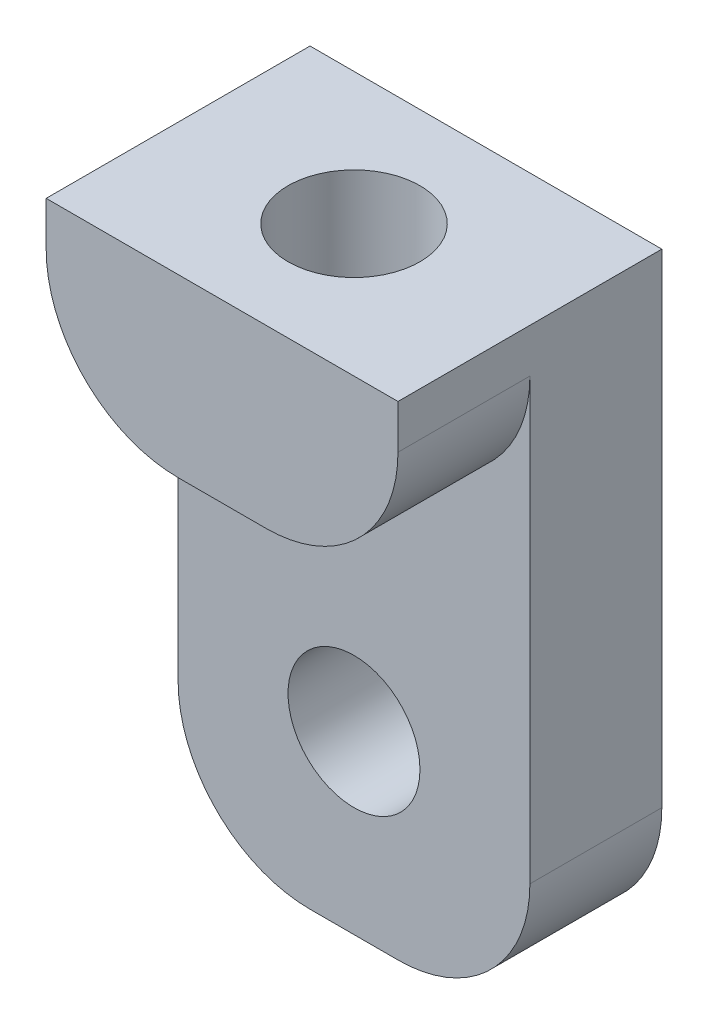
ISO-10303-21;
HEADER;
FILE_DESCRIPTION(('STEP AP214'),'2;1');
FILE_NAME('part.step','',(''),(''),'','','');
FILE_SCHEMA(('AUTOMOTIVE_DESIGN { 1 0 10303 214 1 1 1 1 }'));
ENDSEC;
DATA;
#1=APPLICATION_CONTEXT('core data for automotive mechanical design processes');
#2=APPLICATION_PROTOCOL_DEFINITION('international standard','automotive_design',2000,#1);
#3=PRODUCT_CONTEXT('',#1,'mechanical');
#4=PRODUCT('Part','Part','',(#3));
#5=PRODUCT_RELATED_PRODUCT_CATEGORY('part','',(#4));
#6=PRODUCT_DEFINITION_FORMATION('','',#4);
#7=PRODUCT_DEFINITION_CONTEXT('part definition',#1,'design');
#8=PRODUCT_DEFINITION('design','',#6,#7);
#9=PRODUCT_DEFINITION_SHAPE('','',#8);
#10=(LENGTH_UNIT() NAMED_UNIT(*) SI_UNIT(.MILLI.,.METRE.));
#11=(NAMED_UNIT(*) PLANE_ANGLE_UNIT() SI_UNIT($,.RADIAN.));
#12=(NAMED_UNIT(*) SI_UNIT($,.STERADIAN.) SOLID_ANGLE_UNIT());
#13=UNCERTAINTY_MEASURE_WITH_UNIT(LENGTH_MEASURE(1.E-05),#10,'distance_accuracy_value','');
#14=(GEOMETRIC_REPRESENTATION_CONTEXT(3) GLOBAL_UNCERTAINTY_ASSIGNED_CONTEXT((#13)) GLOBAL_UNIT_ASSIGNED_CONTEXT((#10,
#11,#12)) REPRESENTATION_CONTEXT('',''));
#15=CARTESIAN_POINT('',(0.,0.,0.));
#16=DIRECTION('',(0.,0.,1.));
#17=DIRECTION('',(1.,0.,0.));
#18=AXIS2_PLACEMENT_3D('',#15,#16,#17);
#19=CARTESIAN_POINT('',(0.,30.,0.));
#20=DIRECTION('',(0.,1.,0.));
#21=DIRECTION('',(0.,0.,1.));
#22=AXIS2_PLACEMENT_3D('',#19,#20,#21);
#23=PLANE('',#22);
#24=CARTESIAN_POINT('',(0.,30.,15.));
#25=DIRECTION('',(0.,1.,0.));
#26=DIRECTION('',(0.,0.,1.));
#27=AXIS2_PLACEMENT_3D('',#24,#25,#26);
#28=CIRCLE('',#27,7.5);
#29=CARTESIAN_POINT('',(7.5,30.,15.));
#30=VERTEX_POINT('',#29);
#31=CARTESIAN_POINT('',(-7.5,30.,15.));
#32=VERTEX_POINT('',#31);
#33=EDGE_CURVE('E54',#30,#32,#28,.T.);
#34=ORIENTED_EDGE('',*,*,#33,.T.);
#35=DIRECTION('',(1.,0.,0.));
#36=VECTOR('',#35,1.);
#37=CARTESIAN_POINT('',(-20.,30.,15.));
#38=LINE('',#37,#36);
#39=EDGE_CURVE('E57',#32,#30,#38,.T.);
#40=ORIENTED_EDGE('',*,*,#39,.T.);
#41=EDGE_LOOP('',(#34,#40));
#42=FACE_BOUND('',#41,.T.);
#43=ADVANCED_FACE('F39',(#42),#23,.T.);
#44=CARTESIAN_POINT('',(0.,0.,30.));
#45=DIRECTION('',(0.,0.,1.));
#46=DIRECTION('',(1.,0.,0.));
#47=AXIS2_PLACEMENT_3D('',#44,#45,#46);
#48=PLANE('',#47);
#49=DIRECTION('',(0.,-1.,0.));
#50=VECTOR('',#49,1.);
#51=CARTESIAN_POINT('',(-20.,50.,30.));
#52=LINE('',#51,#50);
#53=CARTESIAN_POINT('',(-20.,50.,30.));
#54=VERTEX_POINT('',#53);
#55=CARTESIAN_POINT('',(-20.,45.,30.));
#56=VERTEX_POINT('',#55);
#57=EDGE_CURVE('E138',#54,#56,#52,.T.);
#58=ORIENTED_EDGE('',*,*,#57,.T.);
#59=CARTESIAN_POINT('',(-5.00000000000001,45.,30.));
#60=DIRECTION('',(0.,0.,1.));
#61=DIRECTION('',(1.,0.,0.));
#62=AXIS2_PLACEMENT_3D('',#59,#60,#61);
#63=CIRCLE('',#62,15.);
#64=CARTESIAN_POINT('',(-5.00000000000001,30.,30.));
#65=VERTEX_POINT('',#64);
#66=EDGE_CURVE('E189',#56,#65,#63,.T.);
#67=ORIENTED_EDGE('',*,*,#66,.T.);
#68=DIRECTION('',(1.,0.,0.));
#69=VECTOR('',#68,1.);
#70=CARTESIAN_POINT('',(-20.,30.,30.));
#71=LINE('',#70,#69);
#72=CARTESIAN_POINT('',(5.00000000000001,30.,30.));
#73=VERTEX_POINT('',#72);
#74=EDGE_CURVE('E413',#65,#73,#71,.T.);
#75=ORIENTED_EDGE('',*,*,#74,.T.);
#76=CARTESIAN_POINT('',(5.00000000000001,45.,30.));
#77=DIRECTION('',(0.,0.,1.));
#78=DIRECTION('',(1.,0.,0.));
#79=AXIS2_PLACEMENT_3D('',#76,#77,#78);
#80=CIRCLE('',#79,15.);
#81=CARTESIAN_POINT('',(20.,45.,30.));
#82=VERTEX_POINT('',#81);
#83=EDGE_CURVE('E133',#73,#82,#80,.T.);
#84=ORIENTED_EDGE('',*,*,#83,.T.);
#85=DIRECTION('',(0.,1.,0.));
#86=VECTOR('',#85,1.);
#87=CARTESIAN_POINT('',(20.,50.,30.));
#88=LINE('',#87,#86);
#89=CARTESIAN_POINT('',(20.,50.,30.));
#90=VERTEX_POINT('',#89);
#91=EDGE_CURVE('E125',#82,#90,#88,.T.);
#92=ORIENTED_EDGE('',*,*,#91,.T.);
#93=DIRECTION('',(-1.,0.,0.));
#94=VECTOR('',#93,1.);
#95=CARTESIAN_POINT('',(-20.,50.,30.));
#96=LINE('',#95,#94);
#97=EDGE_CURVE('E130',#90,#54,#96,.T.);
#98=ORIENTED_EDGE('',*,*,#97,.T.);
#99=EDGE_LOOP('',(#58,#67,#75,#84,#92,#98));
#100=FACE_BOUND('',#99,.T.);
#101=ADVANCED_FACE('F128',(#100),#48,.T.);
#102=CARTESIAN_POINT('',(-20.,50.,30.));
#103=DIRECTION('',(1.,0.,0.));
#104=DIRECTION('',(0.,1.,0.));
#105=AXIS2_PLACEMENT_3D('',#102,#103,#104);
#106=PLANE('',#105);
#107=DIRECTION('',(0.,1.,0.));
#108=VECTOR('',#107,1.);
#109=CARTESIAN_POINT('',(-20.,-20.,15.));
#110=LINE('',#109,#108);
#111=CARTESIAN_POINT('',(-20.,-5.,15.));
#112=VERTEX_POINT('',#111);
#113=CARTESIAN_POINT('',(-20.,45.,15.));
#114=VERTEX_POINT('',#113);
#115=EDGE_CURVE('E180',#112,#114,#110,.T.);
#116=ORIENTED_EDGE('',*,*,#115,.T.);
#117=DIRECTION('',(0.,0.,1.));
#118=VECTOR('',#117,1.);
#119=CARTESIAN_POINT('',(-20.,45.,30.));
#120=LINE('',#119,#118);
#121=EDGE_CURVE('E183',#114,#56,#120,.T.);
#122=ORIENTED_EDGE('',*,*,#121,.T.);
#123=ORIENTED_EDGE('',*,*,#57,.F.);
#124=DIRECTION('',(0.,0.,-1.));
#125=VECTOR('',#124,1.);
#126=CARTESIAN_POINT('',(-20.,50.,30.));
#127=LINE('',#126,#125);
#128=CARTESIAN_POINT('',(-20.,50.,0.));
#129=VERTEX_POINT('',#128);
#130=EDGE_CURVE('E150',#54,#129,#127,.T.);
#131=ORIENTED_EDGE('',*,*,#130,.T.);
#132=DIRECTION('',(0.,-1.,0.));
#133=VECTOR('',#132,1.);
#134=CARTESIAN_POINT('',(-20.,50.,0.));
#135=LINE('',#134,#133);
#136=CARTESIAN_POINT('',(-20.,-5.,0.));
#137=VERTEX_POINT('',#136);
#138=EDGE_CURVE('E161',#129,#137,#135,.T.);
#139=ORIENTED_EDGE('',*,*,#138,.T.);
#140=DIRECTION('',(0.,0.,-1.));
#141=VECTOR('',#140,1.);
#142=CARTESIAN_POINT('',(-20.,-5.,30.));
#143=LINE('',#142,#141);
#144=EDGE_CURVE('E149',#137,#112,#143,.F.);
#145=ORIENTED_EDGE('',*,*,#144,.T.);
#146=EDGE_LOOP('',(#116,#122,#123,#131,#139,#145));
#147=FACE_BOUND('',#146,.T.);
#148=ADVANCED_FACE('F234',(#147),#106,.F.);
#149=CARTESIAN_POINT('',(-20.,-20.,30.));
#150=DIRECTION('',(0.,1.,0.));
#151=DIRECTION('',(0.,0.,1.));
#152=AXIS2_PLACEMENT_3D('',#149,#150,#151);
#153=PLANE('',#152);
#154=DIRECTION('',(1.,0.,0.));
#155=VECTOR('',#154,1.);
#156=CARTESIAN_POINT('',(-20.,-20.,0.));
#157=LINE('',#156,#155);
#158=CARTESIAN_POINT('',(-5.,-20.,0.));
#159=VERTEX_POINT('',#158);
#160=CARTESIAN_POINT('',(5.,-20.,0.));
#161=VERTEX_POINT('',#160);
#162=EDGE_CURVE('E165',#159,#161,#157,.T.);
#163=ORIENTED_EDGE('',*,*,#162,.T.);
#164=DIRECTION('',(0.,0.,-1.));
#165=VECTOR('',#164,1.);
#166=CARTESIAN_POINT('',(5.,-20.,30.));
#167=LINE('',#166,#165);
#168=CARTESIAN_POINT('',(5.,-20.,15.));
#169=VERTEX_POINT('',#168);
#170=EDGE_CURVE('E350',#161,#169,#167,.F.);
#171=ORIENTED_EDGE('',*,*,#170,.T.);
#172=DIRECTION('',(1.,0.,0.));
#173=VECTOR('',#172,1.);
#174=CARTESIAN_POINT('',(-20.,-20.,15.));
#175=LINE('',#174,#173);
#176=CARTESIAN_POINT('',(-5.,-20.,15.));
#177=VERTEX_POINT('',#176);
#178=EDGE_CURVE('E402',#177,#169,#175,.T.);
#179=ORIENTED_EDGE('',*,*,#178,.F.);
#180=DIRECTION('',(0.,0.,-1.));
#181=VECTOR('',#180,1.);
#182=CARTESIAN_POINT('',(-5.,-20.,30.));
#183=LINE('',#182,#181);
#184=EDGE_CURVE('E343',#177,#159,#183,.T.);
#185=ORIENTED_EDGE('',*,*,#184,.T.);
#186=EDGE_LOOP('',(#163,#171,#179,#185));
#187=FACE_BOUND('',#186,.T.);
#188=ADVANCED_FACE('F243',(#187),#153,.F.);
#189=CARTESIAN_POINT('',(20.,50.,30.));
#190=DIRECTION('',(-1.,0.,0.));
#191=DIRECTION('',(0.,-1.,0.));
#192=AXIS2_PLACEMENT_3D('',#189,#190,#191);
#193=PLANE('',#192);
#194=ORIENTED_EDGE('',*,*,#91,.F.);
#195=DIRECTION('',(0.,0.,1.));
#196=VECTOR('',#195,1.);
#197=CARTESIAN_POINT('',(20.,45.,15.));
#198=LINE('',#197,#196);
#199=CARTESIAN_POINT('',(20.,45.,15.));
#200=VERTEX_POINT('',#199);
#201=EDGE_CURVE('E387',#82,#200,#198,.F.);
#202=ORIENTED_EDGE('',*,*,#201,.T.);
#203=DIRECTION('',(0.,1.,0.));
#204=VECTOR('',#203,1.);
#205=CARTESIAN_POINT('',(20.,-20.,15.));
#206=LINE('',#205,#204);
#207=CARTESIAN_POINT('',(20.,-5.00000000000001,15.));
#208=VERTEX_POINT('',#207);
#209=EDGE_CURVE('E407',#208,#200,#206,.T.);
#210=ORIENTED_EDGE('',*,*,#209,.F.);
#211=DIRECTION('',(0.,0.,-1.));
#212=VECTOR('',#211,1.);
#213=CARTESIAN_POINT('',(20.,-5.,30.));
#214=LINE('',#213,#212);
#215=CARTESIAN_POINT('',(20.,-5.,0.));
#216=VERTEX_POINT('',#215);
#217=EDGE_CURVE('E391',#208,#216,#214,.T.);
#218=ORIENTED_EDGE('',*,*,#217,.T.);
#219=DIRECTION('',(0.,1.,0.));
#220=VECTOR('',#219,1.);
#221=CARTESIAN_POINT('',(20.,50.,0.));
#222=LINE('',#221,#220);
#223=CARTESIAN_POINT('',(20.,50.,0.));
#224=VERTEX_POINT('',#223);
#225=EDGE_CURVE('E145',#216,#224,#222,.T.);
#226=ORIENTED_EDGE('',*,*,#225,.T.);
#227=DIRECTION('',(0.,0.,-1.));
#228=VECTOR('',#227,1.);
#229=CARTESIAN_POINT('',(20.,50.,30.));
#230=LINE('',#229,#228);
#231=EDGE_CURVE('E141',#90,#224,#230,.T.);
#232=ORIENTED_EDGE('',*,*,#231,.F.);
#233=EDGE_LOOP('',(#194,#202,#210,#218,#226,#232));
#234=FACE_BOUND('',#233,.T.);
#235=ADVANCED_FACE('F142',(#234),#193,.F.);
#236=CARTESIAN_POINT('',(0.,0.,30.));
#237=DIRECTION('',(0.,0.,-1.));
#238=DIRECTION('',(-1.,0.,0.));
#239=AXIS2_PLACEMENT_3D('',#236,#237,#238);
#240=CYLINDRICAL_SURFACE('',#239,7.5);
#241=CARTESIAN_POINT('',(0.,0.,0.));
#242=DIRECTION('',(0.,0.,1.));
#243=DIRECTION('',(1.,0.,0.));
#244=AXIS2_PLACEMENT_3D('',#241,#242,#243);
#245=CIRCLE('',#244,7.5);
#246=CARTESIAN_POINT('',(7.5,0.,0.));
#247=VERTEX_POINT('',#246);
#248=EDGE_CURVE('E166',#247,#247,#245,.T.);
#249=ORIENTED_EDGE('',*,*,#248,.F.);
#250=EDGE_LOOP('',(#249));
#251=FACE_BOUND('',#250,.T.);
#252=CARTESIAN_POINT('',(0.,0.,15.));
#253=DIRECTION('',(0.,0.,1.));
#254=DIRECTION('',(1.,0.,0.));
#255=AXIS2_PLACEMENT_3D('',#252,#253,#254);
#256=CIRCLE('',#255,7.5);
#257=CARTESIAN_POINT('',(7.5,0.,15.));
#258=VERTEX_POINT('',#257);
#259=EDGE_CURVE('E175',#258,#258,#256,.T.);
#260=ORIENTED_EDGE('',*,*,#259,.T.);
#261=EDGE_LOOP('',(#260));
#262=FACE_BOUND('',#261,.T.);
#263=ADVANCED_FACE('F226',(#251,#262),#240,.F.);
#264=CARTESIAN_POINT('',(0.,0.,0.));
#265=DIRECTION('',(0.,0.,1.));
#266=DIRECTION('',(1.,0.,0.));
#267=AXIS2_PLACEMENT_3D('',#264,#265,#266);
#268=PLANE('',#267);
#269=ORIENTED_EDGE('',*,*,#225,.F.);
#270=CARTESIAN_POINT('',(5.,-5.,0.));
#271=DIRECTION('',(0.,0.,1.));
#272=DIRECTION('',(1.,0.,0.));
#273=AXIS2_PLACEMENT_3D('',#270,#271,#272);
#274=CIRCLE('',#273,15.);
#275=EDGE_CURVE('E395',#216,#161,#274,.F.);
#276=ORIENTED_EDGE('',*,*,#275,.T.);
#277=ORIENTED_EDGE('',*,*,#162,.F.);
#278=CARTESIAN_POINT('',(-5.,-5.,0.));
#279=DIRECTION('',(0.,0.,1.));
#280=DIRECTION('',(1.,0.,0.));
#281=AXIS2_PLACEMENT_3D('',#278,#279,#280);
#282=CIRCLE('',#281,15.);
#283=EDGE_CURVE('E390',#159,#137,#282,.F.);
#284=ORIENTED_EDGE('',*,*,#283,.T.);
#285=ORIENTED_EDGE('',*,*,#138,.F.);
#286=DIRECTION('',(-1.,0.,0.));
#287=VECTOR('',#286,1.);
#288=CARTESIAN_POINT('',(-20.,50.,0.));
#289=LINE('',#288,#287);
#290=EDGE_CURVE('E172',#224,#129,#289,.T.);
#291=ORIENTED_EDGE('',*,*,#290,.F.);
#292=EDGE_LOOP('',(#269,#276,#277,#284,#285,#291));
#293=FACE_BOUND('',#292,.T.);
#294=ORIENTED_EDGE('',*,*,#248,.T.);
#295=EDGE_LOOP('',(#294));
#296=FACE_BOUND('',#295,.T.);
#297=ADVANCED_FACE('F230',(#293,#296),#268,.F.);
#298=CARTESIAN_POINT('',(-20.,50.,30.));
#299=DIRECTION('',(0.,-1.,0.));
#300=DIRECTION('',(0.,0.,-1.));
#301=AXIS2_PLACEMENT_3D('',#298,#299,#300);
#302=PLANE('',#301);
#303=CARTESIAN_POINT('',(0.,50.,15.));
#304=DIRECTION('',(0.,1.,0.));
#305=DIRECTION('',(0.,0.,1.));
#306=AXIS2_PLACEMENT_3D('',#303,#304,#305);
#307=CIRCLE('',#306,7.5);
#308=CARTESIAN_POINT('',(0.,50.,22.5));
#309=VERTEX_POINT('',#308);
#310=EDGE_CURVE('E374',#309,#309,#307,.T.);
#311=ORIENTED_EDGE('',*,*,#310,.F.);
#312=EDGE_LOOP('',(#311));
#313=FACE_BOUND('',#312,.T.);
#314=ORIENTED_EDGE('',*,*,#290,.T.);
#315=ORIENTED_EDGE('',*,*,#130,.F.);
#316=ORIENTED_EDGE('',*,*,#97,.F.);
#317=ORIENTED_EDGE('',*,*,#231,.T.);
#318=EDGE_LOOP('',(#314,#315,#316,#317));
#319=FACE_BOUND('',#318,.T.);
#320=ADVANCED_FACE('F152',(#313,#319),#302,.F.);
#321=CARTESIAN_POINT('',(0.,30.,15.));
#322=DIRECTION('',(0.,1.,0.));
#323=DIRECTION('',(0.,0.,1.));
#324=AXIS2_PLACEMENT_3D('',#321,#322,#323);
#325=CYLINDRICAL_SURFACE('',#324,7.5);
#326=CARTESIAN_POINT('',(-5.00000000000001,30.,20.5901699437495));
#327=VERTEX_POINT('',#326);
#328=CARTESIAN_POINT('',(5.00000000000001,30.,20.5901699437495));
#329=VERTEX_POINT('',#328);
#330=EDGE_CURVE('E179',#327,#329,#28,.T.);
#331=ORIENTED_EDGE('',*,*,#330,.F.);
#332=CARTESIAN_POINT('',(-5.00000000000001,30.,20.5901699437495));
#333=CARTESIAN_POINT('',(-5.15663344575459,29.9999978303104,20.4501051414938));
#334=CARTESIAN_POINT('',(-5.30732754314871,30.0024537237757,20.3034421050508));
#335=CARTESIAN_POINT('',(-5.59580804645587,30.0111435883526,19.9980934292791));
#336=CARTESIAN_POINT('',(-5.7335975760952,30.0173766424079,19.8394107163865));
#337=CARTESIAN_POINT('',(-5.9952148366046,30.0324779884707,19.5112555362672));
#338=CARTESIAN_POINT('',(-6.11905337737117,30.0413442205223,19.3417915844213));
#339=CARTESIAN_POINT('',(-6.35206901812086,30.0606030984697,18.9931413005001));
#340=CARTESIAN_POINT('',(-6.46124549102694,30.0709958096114,18.8139545530537));
#341=CARTESIAN_POINT('',(-6.66418146031628,30.0922532551697,18.4471174990133));
#342=CARTESIAN_POINT('',(-6.75794330805307,30.1031179172747,18.2594684888317));
#343=CARTESIAN_POINT('',(-6.92943411166736,30.1243570340514,17.8769554999541));
#344=CARTESIAN_POINT('',(-7.00716314928027,30.1347314912221,17.6820915580459));
#345=CARTESIAN_POINT('',(-7.14603413692196,30.1541434492909,17.2865105169181));
#346=CARTESIAN_POINT('',(-7.20717888242539,30.1631811753936,17.0857944104737));
#347=CARTESIAN_POINT('',(-7.31245566261449,30.1792244585586,16.6798679055726));
#348=CARTESIAN_POINT('',(-7.35658773370456,30.1862300199695,16.4746575167339));
#349=CARTESIAN_POINT('',(-7.42766500485304,30.197711400443,16.0602728203928));
#350=CARTESIAN_POINT('',(-7.45453326021265,30.2021758839963,15.8510849871964));
#351=CARTESIAN_POINT('',(-7.4905623375704,30.2081970563272,15.4311464946836));
#352=CARTESIAN_POINT('',(-7.49972308710657,30.2097537332054,15.2203958289755));
#353=CARTESIAN_POINT('',(-7.50026453144197,30.209845257095,14.7988770384197));
#354=CARTESIAN_POINT('',(-7.49164572593859,30.208380189033,14.5881089142293));
#355=CARTESIAN_POINT('',(-7.45669720722081,30.2025356376118,14.168089030511));
#356=CARTESIAN_POINT('',(-7.4303676323111,30.1981561770114,13.9588372591547));
#357=CARTESIAN_POINT('',(-7.36064799928906,30.1868785261535,13.5459946810235));
#358=CARTESIAN_POINT('',(-7.31747808101943,30.1800129151642,13.3423657457407));
#359=CARTESIAN_POINT('',(-7.21436986767921,30.1642565396045,12.9393826214284));
#360=CARTESIAN_POINT('',(-7.15442405514111,30.155364867466,12.7400303920576));
#361=CARTESIAN_POINT('',(-7.01818739304532,30.136230367199,12.3470188916852));
#362=CARTESIAN_POINT('',(-6.94189353402911,30.1259872904285,12.1533606763506));
#363=CARTESIAN_POINT('',(-6.77353044043229,30.1049746885494,11.7731604847035));
#364=CARTESIAN_POINT('',(-6.68146805943198,30.0942053936019,11.5866154596231));
#365=CARTESIAN_POINT('',(-6.47973744880902,30.0728131023185,11.2173651672977));
#366=CARTESIAN_POINT('',(-6.36969614342315,30.0622000006072,11.0348629815442));
#367=CARTESIAN_POINT('',(-6.13444857364372,30.0424950294228,10.6798268314861));
#368=CARTESIAN_POINT('',(-6.00924263972168,30.0334031268096,10.5072926500773));
#369=CARTESIAN_POINT('',(-5.74439588116252,30.0178948657955,10.1732662989898));
#370=CARTESIAN_POINT('',(-5.604740967318,30.0114811501685,10.0117851669272));
#371=CARTESIAN_POINT('',(-5.31210296626037,30.0025321683687,9.70120756269242));
#372=CARTESIAN_POINT('',(-5.15911680082516,29.9999978004693,9.55211396644327));
#373=CARTESIAN_POINT('',(-5.00000000000001,30.,9.40983005625053));
#374=B_SPLINE_CURVE_WITH_KNOTS('',3,(#332,#333,#334,#335,#336,#337,#338,#339,#340,#341,#342,
#343,#344,#345,#346,#347,#348,#349,#350,#351,#352,#353,#354,#355,#356,#357,#358,#359,#360,#361,
#362,#363,#364,#365,#366,#367,#368,#369,#370,#371,#372,#373),.UNSPECIFIED.,.F.,.F.,(4,2,2,2,2,2,
2,2,2,2,2,2,2,2,2,2,2,2,2,2,4),(0.,0.630131786436626,1.26011064450682,1.88959795754474,
2.51911218434564,3.14853029549866,3.77794519779275,4.40725393888139,5.03656133334272,
5.66865443913942,6.30075013155758,6.93282805906215,7.56490105068163,8.18897434663033,
8.81332774589868,9.43779617923999,10.0619938811669,10.7013413169057,11.3406748223252,
11.9806377250904,12.620748790577),.UNSPECIFIED.);
#375=CARTESIAN_POINT('',(-7.5,30.209800542251,15.));
#376=VERTEX_POINT('',#375);
#377=EDGE_CURVE('E209',#327,#376,#374,.T.);
#378=ORIENTED_EDGE('',*,*,#377,.T.);
#379=DIRECTION('',(0.,1.,0.));
#380=VECTOR('',#379,1.);
#381=CARTESIAN_POINT('',(-7.5,30.,15.));
#382=LINE('',#381,#380);
#383=EDGE_CURVE('E11',#376,#32,#382,.F.);
#384=ORIENTED_EDGE('',*,*,#383,.T.);
#385=ORIENTED_EDGE('',*,*,#33,.F.);
#386=DIRECTION('',(0.,1.,0.));
#387=VECTOR('',#386,1.);
#388=CARTESIAN_POINT('',(7.5,30.,15.));
#389=LINE('',#388,#387);
#390=CARTESIAN_POINT('',(7.5,30.209800542251,15.));
#391=VERTEX_POINT('',#390);
#392=EDGE_CURVE('E48',#391,#30,#389,.F.);
#393=ORIENTED_EDGE('',*,*,#392,.F.);
#394=CARTESIAN_POINT('',(5.00000000000001,30.,9.40983005625053));
#395=CARTESIAN_POINT('',(5.15663344575459,29.9999978303104,9.54989485850619));
#396=CARTESIAN_POINT('',(5.30732754314871,30.0024537237757,9.69655789494924));
#397=CARTESIAN_POINT('',(5.59580804645587,30.0111435883526,10.0019065707209));
#398=CARTESIAN_POINT('',(5.7335975760952,30.0173766424079,10.1605892836135));
#399=CARTESIAN_POINT('',(5.9952148366046,30.0324779884707,10.4887444637328));
#400=CARTESIAN_POINT('',(6.11905337737117,30.0413442205223,10.6582084155787));
#401=CARTESIAN_POINT('',(6.35206901812086,30.0606030984697,11.0068586994999));
#402=CARTESIAN_POINT('',(6.46124549102694,30.0709958096114,11.1860454469463));
#403=CARTESIAN_POINT('',(6.66418146031628,30.0922532551697,11.5528825009867));
#404=CARTESIAN_POINT('',(6.75794330805307,30.1031179172747,11.7405315111683));
#405=CARTESIAN_POINT('',(6.92943411166736,30.1243570340514,12.1230445000459));
#406=CARTESIAN_POINT('',(7.00716314928027,30.1347314912221,12.3179084419541));
#407=CARTESIAN_POINT('',(7.14603413692196,30.1541434492909,12.7134894830819));
#408=CARTESIAN_POINT('',(7.20717888242539,30.1631811753936,12.9142055895263));
#409=CARTESIAN_POINT('',(7.31245566261449,30.1792244585586,13.3201320944274));
#410=CARTESIAN_POINT('',(7.35658773370456,30.1862300199695,13.5253424832661));
#411=CARTESIAN_POINT('',(7.42766500485304,30.197711400443,13.9397271796072));
#412=CARTESIAN_POINT('',(7.45453326021265,30.2021758839963,14.1489150128036));
#413=CARTESIAN_POINT('',(7.4905623375704,30.2081970563272,14.5688535053164));
#414=CARTESIAN_POINT('',(7.49972308710657,30.2097537332054,14.7796041710245));
#415=CARTESIAN_POINT('',(7.50026453144197,30.209845257095,15.2011229615803));
#416=CARTESIAN_POINT('',(7.49164572593859,30.208380189033,15.4118910857707));
#417=CARTESIAN_POINT('',(7.45669720722081,30.2025356376118,15.831910969489));
#418=CARTESIAN_POINT('',(7.4303676323111,30.1981561770114,16.0411627408453));
#419=CARTESIAN_POINT('',(7.36064799928906,30.1868785261535,16.4540053189765));
#420=CARTESIAN_POINT('',(7.31747808101943,30.1800129151642,16.6576342542593));
#421=CARTESIAN_POINT('',(7.21436986767922,30.1642565396045,17.0606173785716));
#422=CARTESIAN_POINT('',(7.15442405514111,30.155364867466,17.2599696079424));
#423=CARTESIAN_POINT('',(7.01818739304532,30.136230367199,17.6529811083148));
#424=CARTESIAN_POINT('',(6.94189353402911,30.1259872904285,17.8466393236494));
#425=CARTESIAN_POINT('',(6.77353044043229,30.1049746885494,18.2268395152965));
#426=CARTESIAN_POINT('',(6.68146805943198,30.0942053936019,18.4133845403769));
#427=CARTESIAN_POINT('',(6.47973744880902,30.0728131023185,18.7826348327023));
#428=CARTESIAN_POINT('',(6.36969614342315,30.0622000006072,18.9651370184558));
#429=CARTESIAN_POINT('',(6.13444857364372,30.0424950294228,19.3201731685139));
#430=CARTESIAN_POINT('',(6.00924263972168,30.0334031268096,19.4927073499227));
#431=CARTESIAN_POINT('',(5.74439588116252,30.0178948657955,19.8267337010102));
#432=CARTESIAN_POINT('',(5.604740967318,30.0114811501685,19.9882148330728));
#433=CARTESIAN_POINT('',(5.31210296626037,30.0025321683687,20.2987924373076));
#434=CARTESIAN_POINT('',(5.15911680082516,29.9999978004693,20.4478860335567));
#435=CARTESIAN_POINT('',(5.00000000000001,30.,20.5901699437495));
#436=B_SPLINE_CURVE_WITH_KNOTS('',3,(#394,#395,#396,#397,#398,#399,#400,#401,#402,#403,#404,
#405,#406,#407,#408,#409,#410,#411,#412,#413,#414,#415,#416,#417,#418,#419,#420,#421,#422,#423,
#424,#425,#426,#427,#428,#429,#430,#431,#432,#433,#434,#435),.UNSPECIFIED.,.F.,.F.,(4,2,2,2,2,2,
2,2,2,2,2,2,2,2,2,2,2,2,2,2,4),(0.,0.630131786436628,1.26011064450682,1.88959795754474,
2.51911218434564,3.14853029549866,3.77794519779274,4.40725393888138,5.03656133334272,
5.66865443913942,6.30075013155757,6.93282805906215,7.56490105068163,8.18897434663033,
8.81332774589869,9.43779617923999,10.0619938811669,10.7013413169057,11.3406748223252,
11.9806377250904,12.620748790577),.UNSPECIFIED.);
#437=EDGE_CURVE('E200',#391,#329,#436,.T.);
#438=ORIENTED_EDGE('',*,*,#437,.T.);
#439=EDGE_LOOP('',(#331,#378,#384,#385,#393,#438));
#440=FACE_BOUND('',#439,.T.);
#441=ORIENTED_EDGE('',*,*,#310,.T.);
#442=EDGE_LOOP('',(#441));
#443=FACE_BOUND('',#442,.T.);
#444=ADVANCED_FACE('F218',(#440,#443),#325,.F.);
#445=CARTESIAN_POINT('',(-20.,30.,15.));
#446=DIRECTION('',(0.,-1.,0.));
#447=DIRECTION('',(0.,0.,-1.));
#448=AXIS2_PLACEMENT_3D('',#445,#446,#447);
#449=PLANE('',#448);
#450=ORIENTED_EDGE('',*,*,#74,.F.);
#451=DIRECTION('',(0.,0.,1.));
#452=VECTOR('',#451,1.);
#453=CARTESIAN_POINT('',(-5.00000000000001,30.,15.));
#454=LINE('',#453,#452);
#455=EDGE_CURVE('E196',#65,#327,#454,.F.);
#456=ORIENTED_EDGE('',*,*,#455,.T.);
#457=ORIENTED_EDGE('',*,*,#330,.T.);
#458=DIRECTION('',(0.,0.,1.));
#459=VECTOR('',#458,1.);
#460=CARTESIAN_POINT('',(5.00000000000001,30.,30.));
#461=LINE('',#460,#459);
#462=EDGE_CURVE('E192',#329,#73,#461,.T.);
#463=ORIENTED_EDGE('',*,*,#462,.T.);
#464=EDGE_LOOP('',(#450,#456,#457,#463));
#465=FACE_BOUND('',#464,.T.);
#466=ADVANCED_FACE('F223',(#465),#449,.T.);
#467=CARTESIAN_POINT('',(0.,0.,15.));
#468=DIRECTION('',(0.,0.,1.));
#469=DIRECTION('',(1.,0.,0.));
#470=AXIS2_PLACEMENT_3D('',#467,#468,#469);
#471=PLANE('',#470);
#472=ORIENTED_EDGE('',*,*,#259,.F.);
#473=EDGE_LOOP('',(#472));
#474=FACE_BOUND('',#473,.T.);
#475=ORIENTED_EDGE('',*,*,#178,.T.);
#476=CARTESIAN_POINT('',(5.,-5.,15.));
#477=DIRECTION('',(0.,0.,1.));
#478=DIRECTION('',(1.,0.,0.));
#479=AXIS2_PLACEMENT_3D('',#476,#477,#478);
#480=CIRCLE('',#479,15.);
#481=EDGE_CURVE('E349',#169,#208,#480,.T.);
#482=ORIENTED_EDGE('',*,*,#481,.T.);
#483=ORIENTED_EDGE('',*,*,#209,.T.);
#484=CARTESIAN_POINT('',(5.00000000000001,45.,15.));
#485=DIRECTION('',(0.,0.,1.));
#486=DIRECTION('',(1.,0.,0.));
#487=AXIS2_PLACEMENT_3D('',#484,#485,#486);
#488=CIRCLE('',#487,15.);
#489=EDGE_CURVE('E362',#200,#391,#488,.F.);
#490=ORIENTED_EDGE('',*,*,#489,.T.);
#491=ORIENTED_EDGE('',*,*,#392,.T.);
#492=ORIENTED_EDGE('',*,*,#39,.F.);
#493=ORIENTED_EDGE('',*,*,#383,.F.);
#494=CARTESIAN_POINT('',(-5.00000000000001,45.,15.));
#495=DIRECTION('',(0.,0.,1.));
#496=DIRECTION('',(1.,0.,0.));
#497=AXIS2_PLACEMENT_3D('',#494,#495,#496);
#498=CIRCLE('',#497,15.);
#499=EDGE_CURVE('E354',#376,#114,#498,.F.);
#500=ORIENTED_EDGE('',*,*,#499,.T.);
#501=ORIENTED_EDGE('',*,*,#115,.F.);
#502=CARTESIAN_POINT('',(-5.,-5.,15.));
#503=DIRECTION('',(0.,0.,1.));
#504=DIRECTION('',(1.,0.,0.));
#505=AXIS2_PLACEMENT_3D('',#502,#503,#504);
#506=CIRCLE('',#505,15.);
#507=EDGE_CURVE('E341',#112,#177,#506,.T.);
#508=ORIENTED_EDGE('',*,*,#507,.T.);
#509=EDGE_LOOP('',(#475,#482,#483,#490,#491,#492,#493,#500,#501,#508));
#510=FACE_BOUND('',#509,.T.);
#511=ADVANCED_FACE('F252',(#474,#510),#471,.T.);
#512=CARTESIAN_POINT('',(-5.00000000000001,45.,30.));
#513=DIRECTION('',(0.,0.,-1.));
#514=DIRECTION('',(-1.,0.,0.));
#515=AXIS2_PLACEMENT_3D('',#512,#513,#514);
#516=CYLINDRICAL_SURFACE('',#515,15.);
#517=ORIENTED_EDGE('',*,*,#499,.F.);
#518=ORIENTED_EDGE('',*,*,#377,.F.);
#519=ORIENTED_EDGE('',*,*,#455,.F.);
#520=ORIENTED_EDGE('',*,*,#66,.F.);
#521=ORIENTED_EDGE('',*,*,#121,.F.);
#522=EDGE_LOOP('',(#517,#518,#519,#520,#521));
#523=FACE_BOUND('',#522,.T.);
#524=ADVANCED_FACE('F249',(#523),#516,.T.);
#525=CARTESIAN_POINT('',(5.00000000000001,45.,15.));
#526=DIRECTION('',(0.,0.,-1.));
#527=DIRECTION('',(-1.,0.,0.));
#528=AXIS2_PLACEMENT_3D('',#525,#526,#527);
#529=CYLINDRICAL_SURFACE('',#528,15.);
#530=ORIENTED_EDGE('',*,*,#437,.F.);
#531=ORIENTED_EDGE('',*,*,#489,.F.);
#532=ORIENTED_EDGE('',*,*,#201,.F.);
#533=ORIENTED_EDGE('',*,*,#83,.F.);
#534=ORIENTED_EDGE('',*,*,#462,.F.);
#535=EDGE_LOOP('',(#530,#531,#532,#533,#534));
#536=FACE_BOUND('',#535,.T.);
#537=ADVANCED_FACE('F216',(#536),#529,.T.);
#538=CARTESIAN_POINT('',(5.,-5.,30.));
#539=DIRECTION('',(0.,0.,-1.));
#540=DIRECTION('',(-1.,0.,0.));
#541=AXIS2_PLACEMENT_3D('',#538,#539,#540);
#542=CYLINDRICAL_SURFACE('',#541,15.);
#543=ORIENTED_EDGE('',*,*,#481,.F.);
#544=ORIENTED_EDGE('',*,*,#170,.F.);
#545=ORIENTED_EDGE('',*,*,#275,.F.);
#546=ORIENTED_EDGE('',*,*,#217,.F.);
#547=EDGE_LOOP('',(#543,#544,#545,#546));
#548=FACE_BOUND('',#547,.T.);
#549=ADVANCED_FACE('F258',(#548),#542,.T.);
#550=CARTESIAN_POINT('',(-5.,-5.,30.));
#551=DIRECTION('',(0.,0.,-1.));
#552=DIRECTION('',(-1.,0.,0.));
#553=AXIS2_PLACEMENT_3D('',#550,#551,#552);
#554=CYLINDRICAL_SURFACE('',#553,15.);
#555=ORIENTED_EDGE('',*,*,#507,.F.);
#556=ORIENTED_EDGE('',*,*,#144,.F.);
#557=ORIENTED_EDGE('',*,*,#283,.F.);
#558=ORIENTED_EDGE('',*,*,#184,.F.);
#559=EDGE_LOOP('',(#555,#556,#557,#558));
#560=FACE_BOUND('',#559,.T.);
#561=ADVANCED_FACE('F41',(#560),#554,.T.);
#562=CLOSED_SHELL('',(#43,#101,#148,#188,#235,#263,#297,#320,#444,#466,#511,#524,#537,#549,#561));
#563=MANIFOLD_SOLID_BREP('B2',#562);
#564=ADVANCED_BREP_SHAPE_REPRESENTATION('',(#18,#563),#14);
#565=SHAPE_DEFINITION_REPRESENTATION(#9,#564);
ENDSEC;
END-ISO-10303-21;
